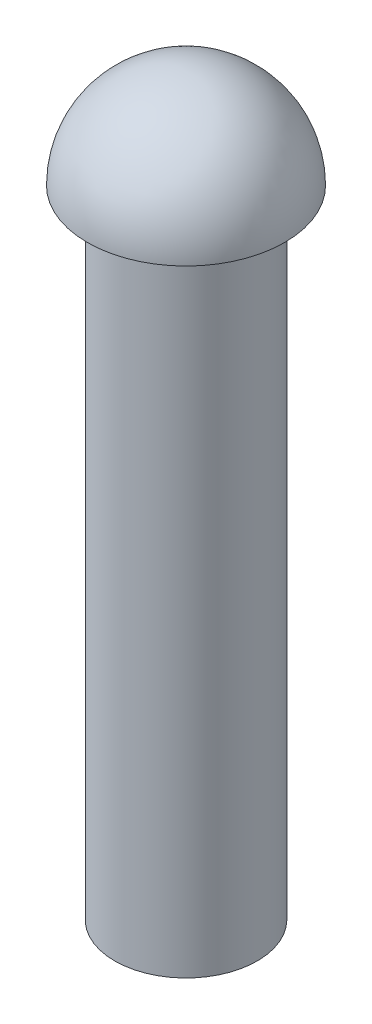
ISO-10303-21;
HEADER;
FILE_DESCRIPTION(('STEP AP214'),'2;1');
FILE_NAME('part.step','',(''),(''),'','','');
FILE_SCHEMA(('AUTOMOTIVE_DESIGN { 1 0 10303 214 1 1 1 1 }'));
ENDSEC;
DATA;
#1=APPLICATION_CONTEXT('core data for automotive mechanical design processes');
#2=APPLICATION_PROTOCOL_DEFINITION('international standard','automotive_design',2000,#1);
#3=PRODUCT_CONTEXT('',#1,'mechanical');
#4=PRODUCT('Part','Part','',(#3));
#5=PRODUCT_RELATED_PRODUCT_CATEGORY('part','',(#4));
#6=PRODUCT_DEFINITION_FORMATION('','',#4);
#7=PRODUCT_DEFINITION_CONTEXT('part definition',#1,'design');
#8=PRODUCT_DEFINITION('design','',#6,#7);
#9=PRODUCT_DEFINITION_SHAPE('','',#8);
#10=(LENGTH_UNIT() NAMED_UNIT(*) SI_UNIT(.MILLI.,.METRE.));
#11=(NAMED_UNIT(*) PLANE_ANGLE_UNIT() SI_UNIT($,.RADIAN.));
#12=(NAMED_UNIT(*) SI_UNIT($,.STERADIAN.) SOLID_ANGLE_UNIT());
#13=UNCERTAINTY_MEASURE_WITH_UNIT(LENGTH_MEASURE(1.E-05),#10,'distance_accuracy_value','');
#14=(GEOMETRIC_REPRESENTATION_CONTEXT(3) GLOBAL_UNCERTAINTY_ASSIGNED_CONTEXT((#13)) GLOBAL_UNIT_ASSIGNED_CONTEXT((#10,
#11,#12)) REPRESENTATION_CONTEXT('',''));
#15=CARTESIAN_POINT('',(0.,0.,0.));
#16=DIRECTION('',(0.,0.,1.));
#17=DIRECTION('',(1.,0.,0.));
#18=AXIS2_PLACEMENT_3D('',#15,#16,#17);
#19=CARTESIAN_POINT('',(0.,0.,0.));
#20=DIRECTION('',(0.,0.,-1.));
#21=DIRECTION('',(-1.,0.,0.));
#22=AXIS2_PLACEMENT_3D('',#19,#20,#21);
#23=SPHERICAL_SURFACE('',#22,9.);
#24=CARTESIAN_POINT('',(0.,0.,0.));
#25=DIRECTION('',(0.,-1.,0.));
#26=DIRECTION('',(0.,0.,1.));
#27=AXIS2_PLACEMENT_3D('',#24,#25,#26);
#28=SPHERICAL_SURFACE('',#27,9.);
#29=CARTESIAN_POINT('',(0.,0.,0.));
#30=DIRECTION('',(0.,-1.,0.));
#31=DIRECTION('',(0.,0.,1.));
#32=AXIS2_PLACEMENT_3D('',#29,#30,#31);
#33=CIRCLE('',#32,9.);
#34=CARTESIAN_POINT('',(0.,0.,9.));
#35=VERTEX_POINT('',#34);
#36=EDGE_CURVE('E10',#35,#35,#33,.T.);
#37=ORIENTED_EDGE('',*,*,#36,.F.);
#38=EDGE_LOOP('',(#37));
#39=FACE_BOUND('',#38,.T.);
#40=ADVANCED_FACE('F47',(#39),#28,.T.);
#41=CARTESIAN_POINT('',(0.,0.,0.));
#42=DIRECTION('',(0.,-1.,0.));
#43=DIRECTION('',(0.,0.,1.));
#44=AXIS2_PLACEMENT_3D('',#41,#42,#43);
#45=PLANE('',#44);
#46=CARTESIAN_POINT('',(0.,0.,0.));
#47=DIRECTION('',(0.,1.,0.));
#48=DIRECTION('',(0.,0.,1.));
#49=AXIS2_PLACEMENT_3D('',#46,#47,#48);
#50=CIRCLE('',#49,6.5);
#51=CARTESIAN_POINT('',(0.,0.,6.5));
#52=VERTEX_POINT('',#51);
#53=EDGE_CURVE('E61',#52,#52,#50,.T.);
#54=ORIENTED_EDGE('',*,*,#53,.T.);
#55=EDGE_LOOP('',(#54));
#56=FACE_BOUND('',#55,.T.);
#57=ORIENTED_EDGE('',*,*,#36,.T.);
#58=EDGE_LOOP('',(#57));
#59=FACE_BOUND('',#58,.T.);
#60=ADVANCED_FACE('F70',(#56,#59),#45,.T.);
#61=CARTESIAN_POINT('',(0.,-58.,0.));
#62=DIRECTION('',(0.,1.,0.));
#63=DIRECTION('',(0.,0.,1.));
#64=AXIS2_PLACEMENT_3D('',#61,#62,#63);
#65=PLANE('',#64);
#66=CARTESIAN_POINT('',(0.,-58.,0.));
#67=DIRECTION('',(0.,1.,0.));
#68=DIRECTION('',(0.,0.,1.));
#69=AXIS2_PLACEMENT_3D('',#66,#67,#68);
#70=CIRCLE('',#69,6.5);
#71=CARTESIAN_POINT('',(0.,-58.,6.49999999999998));
#72=VERTEX_POINT('',#71);
#73=EDGE_CURVE('E54',#72,#72,#70,.T.);
#74=ORIENTED_EDGE('',*,*,#73,.F.);
#75=EDGE_LOOP('',(#74));
#76=FACE_BOUND('',#75,.T.);
#77=ADVANCED_FACE('F74',(#76),#65,.F.);
#78=CARTESIAN_POINT('',(0.,0.,0.));
#79=DIRECTION('',(0.,1.,0.));
#80=DIRECTION('',(0.,0.,1.));
#81=AXIS2_PLACEMENT_3D('',#78,#79,#80);
#82=CYLINDRICAL_SURFACE('',#81,6.5);
#83=ORIENTED_EDGE('',*,*,#53,.F.);
#84=EDGE_LOOP('',(#83));
#85=FACE_BOUND('',#84,.T.);
#86=ORIENTED_EDGE('',*,*,#73,.T.);
#87=EDGE_LOOP('',(#86));
#88=FACE_BOUND('',#87,.T.);
#89=ADVANCED_FACE('F72',(#85,#88),#82,.T.);
#90=CLOSED_SHELL('',(#40,#60,#77,#89));
#91=MANIFOLD_SOLID_BREP('B2',#90);
#92=ADVANCED_BREP_SHAPE_REPRESENTATION('',(#18,#91),#14);
#93=SHAPE_DEFINITION_REPRESENTATION(#9,#92);
ENDSEC;
END-ISO-10303-21;
